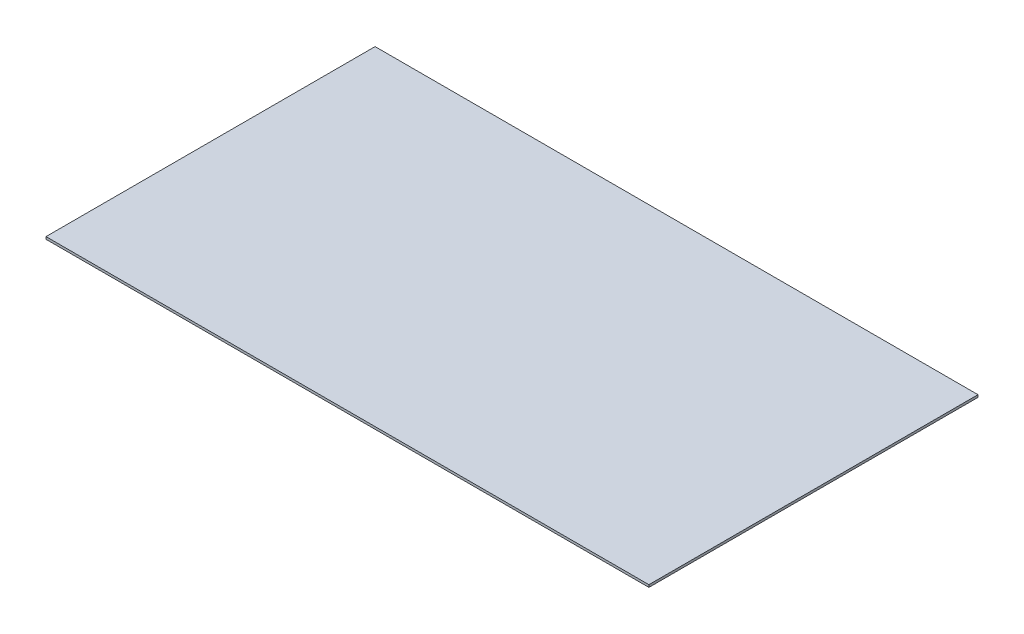
ISO-10303-21;
HEADER;
FILE_DESCRIPTION(('STEP AP214'),'2;1');
FILE_NAME('part.step','',(''),(''),'','','');
FILE_SCHEMA(('AUTOMOTIVE_DESIGN { 1 0 10303 214 1 1 1 1 }'));
ENDSEC;
DATA;
#1=APPLICATION_CONTEXT('core data for automotive mechanical design processes');
#2=APPLICATION_PROTOCOL_DEFINITION('international standard','automotive_design',2000,#1);
#3=PRODUCT_CONTEXT('',#1,'mechanical');
#4=PRODUCT('Part','Part','',(#3));
#5=PRODUCT_RELATED_PRODUCT_CATEGORY('part','',(#4));
#6=PRODUCT_DEFINITION_FORMATION('','',#4);
#7=PRODUCT_DEFINITION_CONTEXT('part definition',#1,'design');
#8=PRODUCT_DEFINITION('design','',#6,#7);
#9=PRODUCT_DEFINITION_SHAPE('','',#8);
#10=(LENGTH_UNIT() NAMED_UNIT(*) SI_UNIT(.MILLI.,.METRE.));
#11=(NAMED_UNIT(*) PLANE_ANGLE_UNIT() SI_UNIT($,.RADIAN.));
#12=(NAMED_UNIT(*) SI_UNIT($,.STERADIAN.) SOLID_ANGLE_UNIT());
#13=UNCERTAINTY_MEASURE_WITH_UNIT(LENGTH_MEASURE(1.E-05),#10,'distance_accuracy_value','');
#14=(GEOMETRIC_REPRESENTATION_CONTEXT(3) GLOBAL_UNCERTAINTY_ASSIGNED_CONTEXT((#13)) GLOBAL_UNIT_ASSIGNED_CONTEXT((#10,
#11,#12)) REPRESENTATION_CONTEXT('',''));
#15=CARTESIAN_POINT('',(0.,0.,0.));
#16=DIRECTION('',(0.,0.,1.));
#17=DIRECTION('',(1.,0.,0.));
#18=AXIS2_PLACEMENT_3D('',#15,#16,#17);
#19=CARTESIAN_POINT('',(0.,3.,0.));
#20=DIRECTION('',(1.,0.,0.));
#21=DIRECTION('',(0.,0.,-1.));
#22=AXIS2_PLACEMENT_3D('',#19,#20,#21);
#23=PLANE('',#22);
#24=DIRECTION('',(0.,0.,1.));
#25=VECTOR('',#24,1.);
#26=CARTESIAN_POINT('',(0.,0.,0.));
#27=LINE('',#26,#25);
#28=CARTESIAN_POINT('',(0.,0.,-415.925000000327));
#29=VERTEX_POINT('',#28);
#30=CARTESIAN_POINT('',(0.,0.,0.));
#31=VERTEX_POINT('',#30);
#32=EDGE_CURVE('E98',#29,#31,#27,.T.);
#33=ORIENTED_EDGE('',*,*,#32,.T.);
#34=DIRECTION('',(0.,-1.,0.));
#35=VECTOR('',#34,1.);
#36=CARTESIAN_POINT('',(0.,3.,0.));
#37=LINE('',#36,#35);
#38=CARTESIAN_POINT('',(0.,3.,0.));
#39=VERTEX_POINT('',#38);
#40=EDGE_CURVE('E11',#39,#31,#37,.T.);
#41=ORIENTED_EDGE('',*,*,#40,.F.);
#42=DIRECTION('',(0.,0.,1.));
#43=VECTOR('',#42,1.);
#44=CARTESIAN_POINT('',(0.,3.,0.));
#45=LINE('',#44,#43);
#46=CARTESIAN_POINT('',(0.,3.,-415.925000000327));
#47=VERTEX_POINT('',#46);
#48=EDGE_CURVE('E86',#47,#39,#45,.T.);
#49=ORIENTED_EDGE('',*,*,#48,.F.);
#50=DIRECTION('',(0.,-1.,0.));
#51=VECTOR('',#50,1.);
#52=CARTESIAN_POINT('',(0.,3.,-415.925000000327));
#53=LINE('',#52,#51);
#54=EDGE_CURVE('E94',#47,#29,#53,.T.);
#55=ORIENTED_EDGE('',*,*,#54,.T.);
#56=EDGE_LOOP('',(#33,#41,#49,#55));
#57=FACE_BOUND('',#56,.T.);
#58=ADVANCED_FACE('F35',(#57),#23,.F.);
#59=CARTESIAN_POINT('',(0.,3.,0.));
#60=DIRECTION('',(0.,0.,-1.));
#61=DIRECTION('',(-1.,0.,0.));
#62=AXIS2_PLACEMENT_3D('',#59,#60,#61);
#63=PLANE('',#62);
#64=DIRECTION('',(1.,0.,0.));
#65=VECTOR('',#64,1.);
#66=CARTESIAN_POINT('',(0.,0.,0.));
#67=LINE('',#66,#65);
#68=CARTESIAN_POINT('',(761.999999999997,0.,0.));
#69=VERTEX_POINT('',#68);
#70=EDGE_CURVE('E90',#31,#69,#67,.T.);
#71=ORIENTED_EDGE('',*,*,#70,.T.);
#72=DIRECTION('',(0.,-1.,0.));
#73=VECTOR('',#72,1.);
#74=CARTESIAN_POINT('',(761.999999999997,3.,0.));
#75=LINE('',#74,#73);
#76=CARTESIAN_POINT('',(761.999999999997,3.,0.));
#77=VERTEX_POINT('',#76);
#78=EDGE_CURVE('E43',#77,#69,#75,.T.);
#79=ORIENTED_EDGE('',*,*,#78,.F.);
#80=DIRECTION('',(1.,0.,0.));
#81=VECTOR('',#80,1.);
#82=CARTESIAN_POINT('',(0.,3.,0.));
#83=LINE('',#82,#81);
#84=EDGE_CURVE('E81',#39,#77,#83,.T.);
#85=ORIENTED_EDGE('',*,*,#84,.F.);
#86=ORIENTED_EDGE('',*,*,#40,.T.);
#87=EDGE_LOOP('',(#71,#79,#85,#86));
#88=FACE_BOUND('',#87,.T.);
#89=ADVANCED_FACE('F89',(#88),#63,.F.);
#90=CARTESIAN_POINT('',(761.999999999997,3.,0.));
#91=DIRECTION('',(-1.,0.,0.));
#92=DIRECTION('',(0.,0.,1.));
#93=AXIS2_PLACEMENT_3D('',#90,#91,#92);
#94=PLANE('',#93);
#95=DIRECTION('',(0.,0.,-1.));
#96=VECTOR('',#95,1.);
#97=CARTESIAN_POINT('',(761.999999999997,0.,0.));
#98=LINE('',#97,#96);
#99=CARTESIAN_POINT('',(761.999999999997,0.,-415.925000000327));
#100=VERTEX_POINT('',#99);
#101=EDGE_CURVE('E68',#69,#100,#98,.T.);
#102=ORIENTED_EDGE('',*,*,#101,.T.);
#103=DIRECTION('',(0.,-1.,0.));
#104=VECTOR('',#103,1.);
#105=CARTESIAN_POINT('',(761.999999999997,3.,-415.925000000327));
#106=LINE('',#105,#104);
#107=CARTESIAN_POINT('',(761.999999999997,3.,-415.925000000327));
#108=VERTEX_POINT('',#107);
#109=EDGE_CURVE('E91',#108,#100,#106,.T.);
#110=ORIENTED_EDGE('',*,*,#109,.F.);
#111=DIRECTION('',(0.,0.,-1.));
#112=VECTOR('',#111,1.);
#113=CARTESIAN_POINT('',(761.999999999997,3.,0.));
#114=LINE('',#113,#112);
#115=EDGE_CURVE('E84',#77,#108,#114,.T.);
#116=ORIENTED_EDGE('',*,*,#115,.F.);
#117=ORIENTED_EDGE('',*,*,#78,.T.);
#118=EDGE_LOOP('',(#102,#110,#116,#117));
#119=FACE_BOUND('',#118,.T.);
#120=ADVANCED_FACE('F92',(#119),#94,.F.);
#121=CARTESIAN_POINT('',(0.,3.,-415.925000000327));
#122=DIRECTION('',(0.,0.,1.));
#123=DIRECTION('',(1.,0.,0.));
#124=AXIS2_PLACEMENT_3D('',#121,#122,#123);
#125=PLANE('',#124);
#126=DIRECTION('',(-1.,0.,0.));
#127=VECTOR('',#126,1.);
#128=CARTESIAN_POINT('',(0.,0.,-415.925000000327));
#129=LINE('',#128,#127);
#130=EDGE_CURVE('E74',#100,#29,#129,.T.);
#131=ORIENTED_EDGE('',*,*,#130,.T.);
#132=ORIENTED_EDGE('',*,*,#54,.F.);
#133=DIRECTION('',(-1.,0.,0.));
#134=VECTOR('',#133,1.);
#135=CARTESIAN_POINT('',(0.,3.,-415.925000000327));
#136=LINE('',#135,#134);
#137=EDGE_CURVE('E51',#108,#47,#136,.T.);
#138=ORIENTED_EDGE('',*,*,#137,.F.);
#139=ORIENTED_EDGE('',*,*,#109,.T.);
#140=EDGE_LOOP('',(#131,#132,#138,#139));
#141=FACE_BOUND('',#140,.T.);
#142=ADVANCED_FACE('F105',(#141),#125,.F.);
#143=CARTESIAN_POINT('',(0.,3.,0.));
#144=DIRECTION('',(0.,-1.,0.));
#145=DIRECTION('',(0.,0.,-1.));
#146=AXIS2_PLACEMENT_3D('',#143,#144,#145);
#147=PLANE('',#146);
#148=ORIENTED_EDGE('',*,*,#48,.T.);
#149=ORIENTED_EDGE('',*,*,#84,.T.);
#150=ORIENTED_EDGE('',*,*,#115,.T.);
#151=ORIENTED_EDGE('',*,*,#137,.T.);
#152=EDGE_LOOP('',(#148,#149,#150,#151));
#153=FACE_BOUND('',#152,.T.);
#154=ADVANCED_FACE('F82',(#153),#147,.F.);
#155=CARTESIAN_POINT('',(0.,0.,0.));
#156=DIRECTION('',(0.,-1.,0.));
#157=DIRECTION('',(0.,0.,-1.));
#158=AXIS2_PLACEMENT_3D('',#155,#156,#157);
#159=PLANE('',#158);
#160=ORIENTED_EDGE('',*,*,#32,.F.);
#161=ORIENTED_EDGE('',*,*,#130,.F.);
#162=ORIENTED_EDGE('',*,*,#101,.F.);
#163=ORIENTED_EDGE('',*,*,#70,.F.);
#164=EDGE_LOOP('',(#160,#161,#162,#163));
#165=FACE_BOUND('',#164,.T.);
#166=ADVANCED_FACE('F108',(#165),#159,.T.);
#167=CLOSED_SHELL('',(#58,#89,#120,#142,#154,#166));
#168=MANIFOLD_SOLID_BREP('B2',#167);
#169=ADVANCED_BREP_SHAPE_REPRESENTATION('',(#18,#168),#14);
#170=SHAPE_DEFINITION_REPRESENTATION(#9,#169);
ENDSEC;
END-ISO-10303-21;
